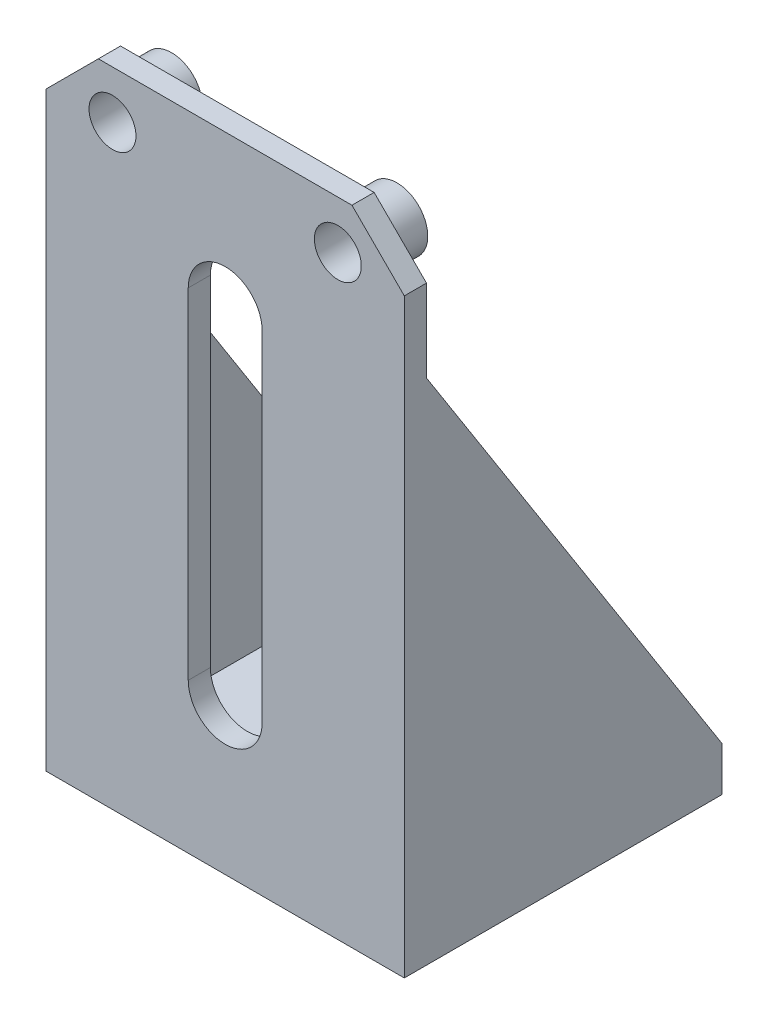
ISO-10303-21;
HEADER;
FILE_DESCRIPTION(('STEP AP214'),'2;1');
FILE_NAME('part.step','',(''),(''),'','','');
FILE_SCHEMA(('AUTOMOTIVE_DESIGN { 1 0 10303 214 1 1 1 1 }'));
ENDSEC;
DATA;
#1=APPLICATION_CONTEXT('core data for automotive mechanical design processes');
#2=APPLICATION_PROTOCOL_DEFINITION('international standard','automotive_design',2000,#1);
#3=PRODUCT_CONTEXT('',#1,'mechanical');
#4=PRODUCT('Part','Part','',(#3));
#5=PRODUCT_RELATED_PRODUCT_CATEGORY('part','',(#4));
#6=PRODUCT_DEFINITION_FORMATION('','',#4);
#7=PRODUCT_DEFINITION_CONTEXT('part definition',#1,'design');
#8=PRODUCT_DEFINITION('design','',#6,#7);
#9=PRODUCT_DEFINITION_SHAPE('','',#8);
#10=(LENGTH_UNIT() NAMED_UNIT(*) SI_UNIT(.MILLI.,.METRE.));
#11=(NAMED_UNIT(*) PLANE_ANGLE_UNIT() SI_UNIT($,.RADIAN.));
#12=(NAMED_UNIT(*) SI_UNIT($,.STERADIAN.) SOLID_ANGLE_UNIT());
#13=UNCERTAINTY_MEASURE_WITH_UNIT(LENGTH_MEASURE(1.E-05),#10,'distance_accuracy_value','');
#14=(GEOMETRIC_REPRESENTATION_CONTEXT(3) GLOBAL_UNCERTAINTY_ASSIGNED_CONTEXT((#13)) GLOBAL_UNIT_ASSIGNED_CONTEXT((#10,
#11,#12)) REPRESENTATION_CONTEXT('',''));
#15=CARTESIAN_POINT('',(0.,0.,0.));
#16=DIRECTION('',(0.,0.,1.));
#17=DIRECTION('',(1.,0.,0.));
#18=AXIS2_PLACEMENT_3D('',#15,#16,#17);
#19=CARTESIAN_POINT('',(0.,0.,0.));
#20=DIRECTION('',(0.,0.,-1.));
#21=DIRECTION('',(-1.,0.,0.));
#22=AXIS2_PLACEMENT_3D('',#19,#20,#21);
#23=PLANE('',#22);
#24=CARTESIAN_POINT('',(-12.1712863458922,57.275,0.));
#25=DIRECTION('',(0.,0.,1.));
#26=DIRECTION('',(1.,0.,0.));
#27=AXIS2_PLACEMENT_3D('',#24,#25,#26);
#28=CIRCLE('',#27,5.);
#29=CARTESIAN_POINT('',(-7.17128634589222,57.275,0.));
#30=VERTEX_POINT('',#29);
#31=CARTESIAN_POINT('',(-17.1712863458922,57.275,0.));
#32=VERTEX_POINT('',#31);
#33=EDGE_CURVE('E257',#30,#32,#28,.T.);
#34=ORIENTED_EDGE('',*,*,#33,.T.);
#35=DIRECTION('',(0.,-1.,0.));
#36=VECTOR('',#35,1.);
#37=CARTESIAN_POINT('',(-17.1712863458922,57.275,0.));
#38=LINE('',#37,#36);
#39=CARTESIAN_POINT('',(-17.1712863458922,11.275,0.));
#40=VERTEX_POINT('',#39);
#41=EDGE_CURVE('E260',#32,#40,#38,.T.);
#42=ORIENTED_EDGE('',*,*,#41,.T.);
#43=CARTESIAN_POINT('',(-12.1712863458922,11.275,0.));
#44=DIRECTION('',(0.,0.,1.));
#45=DIRECTION('',(1.,0.,0.));
#46=AXIS2_PLACEMENT_3D('',#43,#44,#45);
#47=CIRCLE('',#46,5.);
#48=CARTESIAN_POINT('',(-7.17128634589222,11.275,0.));
#49=VERTEX_POINT('',#48);
#50=EDGE_CURVE('E100',#40,#49,#47,.T.);
#51=ORIENTED_EDGE('',*,*,#50,.T.);
#52=DIRECTION('',(0.,1.,0.));
#53=VECTOR('',#52,1.);
#54=CARTESIAN_POINT('',(-7.17128634589222,57.275,0.));
#55=LINE('',#54,#53);
#56=EDGE_CURVE('E265',#49,#30,#55,.T.);
#57=ORIENTED_EDGE('',*,*,#56,.T.);
#58=EDGE_LOOP('',(#34,#42,#51,#57));
#59=FACE_BOUND('',#58,.T.);
#60=CARTESIAN_POINT('',(3.07871365410777,71.55,0.));
#61=DIRECTION('',(0.,0.,-1.));
#62=DIRECTION('',(-1.,0.,0.));
#63=AXIS2_PLACEMENT_3D('',#60,#61,#62);
#64=CIRCLE('',#63,4.175);
#65=CARTESIAN_POINT('',(-1.09628634589223,71.55,0.));
#66=VERTEX_POINT('',#65);
#67=EDGE_CURVE('E298',#66,#66,#64,.T.);
#68=ORIENTED_EDGE('',*,*,#67,.F.);
#69=EDGE_LOOP('',(#68));
#70=FACE_BOUND('',#69,.T.);
#71=CARTESIAN_POINT('',(-27.4212863458922,71.55,0.));
#72=DIRECTION('',(0.,0.,-1.));
#73=DIRECTION('',(-1.,0.,0.));
#74=AXIS2_PLACEMENT_3D('',#71,#72,#73);
#75=CIRCLE('',#74,4.175);
#76=CARTESIAN_POINT('',(-31.5962863458922,71.55,0.));
#77=VERTEX_POINT('',#76);
#78=EDGE_CURVE('E295',#77,#77,#75,.T.);
#79=ORIENTED_EDGE('',*,*,#78,.F.);
#80=EDGE_LOOP('',(#79));
#81=FACE_BOUND('',#80,.T.);
#82=DIRECTION('',(0.,-1.,0.));
#83=VECTOR('',#82,1.);
#84=CARTESIAN_POINT('',(-33.4212863458922,-6.00000000000001,0.));
#85=LINE('',#84,#83);
#86=CARTESIAN_POINT('',(-33.4212863458922,59.8372093023255,0.));
#87=VERTEX_POINT('',#86);
#88=CARTESIAN_POINT('',(-33.4212863458922,-6.00000000000001,0.));
#89=VERTEX_POINT('',#88);
#90=EDGE_CURVE('E312',#87,#89,#85,.T.);
#91=ORIENTED_EDGE('',*,*,#90,.F.);
#92=DIRECTION('',(1.,0.,0.));
#93=VECTOR('',#92,1.);
#94=CARTESIAN_POINT('',(0.,59.8372093023256,0.));
#95=LINE('',#94,#93);
#96=CARTESIAN_POINT('',(-36.4212863458922,59.8372093023255,0.));
#97=VERTEX_POINT('',#96);
#98=EDGE_CURVE('E245',#97,#87,#95,.T.);
#99=ORIENTED_EDGE('',*,*,#98,.F.);
#100=DIRECTION('',(0.,-1.,0.));
#101=VECTOR('',#100,1.);
#102=CARTESIAN_POINT('',(-36.4212863458922,-3.00000000000001,0.));
#103=LINE('',#102,#101);
#104=CARTESIAN_POINT('',(-36.4212863458922,70.964213562373,0.));
#105=VERTEX_POINT('',#104);
#106=EDGE_CURVE('E209',#105,#97,#103,.T.);
#107=ORIENTED_EDGE('',*,*,#106,.F.);
#108=DIRECTION('',(0.707106781186546,0.707106781186549,0.));
#109=VECTOR('',#108,1.);
#110=CARTESIAN_POINT('',(-36.4212863458922,70.964213562373,0.));
#111=LINE('',#110,#109);
#112=CARTESIAN_POINT('',(-29.3354999082653,78.05,0.));
#113=VERTEX_POINT('',#112);
#114=EDGE_CURVE('E233',#105,#113,#111,.T.);
#115=ORIENTED_EDGE('',*,*,#114,.T.);
#116=DIRECTION('',(1.,0.,0.));
#117=VECTOR('',#116,1.);
#118=CARTESIAN_POINT('',(0.,78.05,0.));
#119=LINE('',#118,#117);
#120=CARTESIAN_POINT('',(4.99292721648086,78.05,0.));
#121=VERTEX_POINT('',#120);
#122=EDGE_CURVE('E219',#113,#121,#119,.T.);
#123=ORIENTED_EDGE('',*,*,#122,.T.);
#124=DIRECTION('',(-0.707106781186546,0.707106781186549,0.));
#125=VECTOR('',#124,1.);
#126=CARTESIAN_POINT('',(41.5214636082404,41.5214636082403,0.));
#127=LINE('',#126,#125);
#128=CARTESIAN_POINT('',(12.0787136541078,70.964213562373,0.));
#129=VERTEX_POINT('',#128);
#130=EDGE_CURVE('E215',#129,#121,#127,.T.);
#131=ORIENTED_EDGE('',*,*,#130,.F.);
#132=DIRECTION('',(0.,1.,0.));
#133=VECTOR('',#132,1.);
#134=CARTESIAN_POINT('',(12.0787136541078,-2.99999999999996,0.));
#135=LINE('',#134,#133);
#136=CARTESIAN_POINT('',(12.0787136541078,59.8372093023255,0.));
#137=VERTEX_POINT('',#136);
#138=EDGE_CURVE('E199',#137,#129,#135,.T.);
#139=ORIENTED_EDGE('',*,*,#138,.F.);
#140=DIRECTION('',(1.,0.,0.));
#141=VECTOR('',#140,1.);
#142=CARTESIAN_POINT('',(0.,59.8372093023256,0.));
#143=LINE('',#142,#141);
#144=CARTESIAN_POINT('',(9.07871365410775,59.8372093023255,0.));
#145=VERTEX_POINT('',#144);
#146=EDGE_CURVE('E210',#145,#137,#143,.T.);
#147=ORIENTED_EDGE('',*,*,#146,.F.);
#148=DIRECTION('',(0.,-1.,0.));
#149=VECTOR('',#148,1.);
#150=CARTESIAN_POINT('',(9.07871365410777,48.0313996107964,0.));
#151=LINE('',#150,#149);
#152=CARTESIAN_POINT('',(9.07871365410777,-6.00000000000001,0.));
#153=VERTEX_POINT('',#152);
#154=EDGE_CURVE('E314',#145,#153,#151,.T.);
#155=ORIENTED_EDGE('',*,*,#154,.T.);
#156=DIRECTION('',(1.,0.,0.));
#157=VECTOR('',#156,1.);
#158=CARTESIAN_POINT('',(9.07871365410777,-6.00000000000001,0.));
#159=LINE('',#158,#157);
#160=EDGE_CURVE('E309',#89,#153,#159,.T.);
#161=ORIENTED_EDGE('',*,*,#160,.F.);
#162=EDGE_LOOP('',(#91,#99,#107,#115,#123,#131,#139,#147,#155,#161));
#163=FACE_BOUND('',#162,.T.);
#164=ADVANCED_FACE('F83',(#59,#70,#81,#163),#23,.T.);
#165=CARTESIAN_POINT('',(-33.4212863458922,-6.00000000000001,3.));
#166=DIRECTION('',(1.,0.,0.));
#167=DIRECTION('',(0.,0.,-1.));
#168=AXIS2_PLACEMENT_3D('',#165,#166,#167);
#169=PLANE('',#168);
#170=ORIENTED_EDGE('',*,*,#90,.T.);
#171=DIRECTION('',(0.,0.,-1.));
#172=VECTOR('',#171,1.);
#173=CARTESIAN_POINT('',(-33.4212863458922,-6.00000000000001,3.));
#174=LINE('',#173,#172);
#175=CARTESIAN_POINT('',(-33.4212863458922,-6.00000000000001,-40.));
#176=VERTEX_POINT('',#175);
#177=EDGE_CURVE('E87',#89,#176,#174,.T.);
#178=ORIENTED_EDGE('',*,*,#177,.T.);
#179=DIRECTION('',(0.,-1.,0.));
#180=VECTOR('',#179,1.);
#181=CARTESIAN_POINT('',(-33.4212863458922,-6.00000000000001,-40.));
#182=LINE('',#181,#180);
#183=CARTESIAN_POINT('',(-33.4212863458922,-3.00000000000001,-40.));
#184=VERTEX_POINT('',#183);
#185=EDGE_CURVE('E316',#184,#176,#182,.T.);
#186=ORIENTED_EDGE('',*,*,#185,.F.);
#187=DIRECTION('',(0.,-0.843584345436487,-0.536996696576891));
#188=VECTOR('',#187,1.);
#189=CARTESIAN_POINT('',(-33.4212863458922,64.55,3.));
#190=LINE('',#189,#188);
#191=EDGE_CURVE('E243',#87,#184,#190,.T.);
#192=ORIENTED_EDGE('',*,*,#191,.F.);
#193=EDGE_LOOP('',(#170,#178,#186,#192));
#194=FACE_BOUND('',#193,.T.);
#195=ADVANCED_FACE('F85',(#194),#169,.T.);
#196=CARTESIAN_POINT('',(-36.4212863458922,-3.00000000000001,3.));
#197=DIRECTION('',(-1.,0.,0.));
#198=DIRECTION('',(0.,0.,1.));
#199=AXIS2_PLACEMENT_3D('',#196,#197,#198);
#200=PLANE('',#199);
#201=ORIENTED_EDGE('',*,*,#106,.T.);
#202=DIRECTION('',(0.,-0.843584345436487,-0.536996696576891));
#203=VECTOR('',#202,1.);
#204=CARTESIAN_POINT('',(-36.4212863458922,64.55,3.));
#205=LINE('',#204,#203);
#206=CARTESIAN_POINT('',(-36.4212863458922,-3.00000000000001,-40.));
#207=VERTEX_POINT('',#206);
#208=EDGE_CURVE('E231',#97,#207,#205,.T.);
#209=ORIENTED_EDGE('',*,*,#208,.T.);
#210=DIRECTION('',(0.,1.,0.));
#211=VECTOR('',#210,1.);
#212=CARTESIAN_POINT('',(-36.4212863458922,-3.00000000000001,-40.));
#213=LINE('',#212,#211);
#214=CARTESIAN_POINT('',(-36.4212863458922,-9.00000000000002,-40.));
#215=VERTEX_POINT('',#214);
#216=EDGE_CURVE('E333',#215,#207,#213,.T.);
#217=ORIENTED_EDGE('',*,*,#216,.F.);
#218=DIRECTION('',(0.,0.,-1.));
#219=VECTOR('',#218,1.);
#220=CARTESIAN_POINT('',(-36.4212863458922,-9.00000000000002,3.));
#221=LINE('',#220,#219);
#222=CARTESIAN_POINT('',(-36.4212863458922,-9.00000000000002,3.));
#223=VERTEX_POINT('',#222);
#224=EDGE_CURVE('E12',#223,#215,#221,.T.);
#225=ORIENTED_EDGE('',*,*,#224,.F.);
#226=DIRECTION('',(0.,1.,0.));
#227=VECTOR('',#226,1.);
#228=CARTESIAN_POINT('',(-36.4212863458922,-3.00000000000001,3.));
#229=LINE('',#228,#227);
#230=CARTESIAN_POINT('',(-36.4212863458922,70.964213562373,3.));
#231=VERTEX_POINT('',#230);
#232=EDGE_CURVE('E343',#223,#231,#229,.T.);
#233=ORIENTED_EDGE('',*,*,#232,.T.);
#234=DIRECTION('',(0.,0.,1.));
#235=VECTOR('',#234,1.);
#236=CARTESIAN_POINT('',(-36.4212863458922,70.964213562373,0.));
#237=LINE('',#236,#235);
#238=EDGE_CURVE('E229',#105,#231,#237,.T.);
#239=ORIENTED_EDGE('',*,*,#238,.F.);
#240=EDGE_LOOP('',(#201,#209,#217,#225,#233,#239));
#241=FACE_BOUND('',#240,.T.);
#242=ADVANCED_FACE('F363',(#241),#200,.T.);
#243=CARTESIAN_POINT('',(-36.4212863458922,-9.00000000000002,3.));
#244=DIRECTION('',(0.,-1.,0.));
#245=DIRECTION('',(0.,0.,-1.));
#246=AXIS2_PLACEMENT_3D('',#243,#244,#245);
#247=PLANE('',#246);
#248=ORIENTED_EDGE('',*,*,#224,.T.);
#249=DIRECTION('',(-1.,0.,0.));
#250=VECTOR('',#249,1.);
#251=CARTESIAN_POINT('',(12.0787136541078,-9.00000000000002,-40.));
#252=LINE('',#251,#250);
#253=CARTESIAN_POINT('',(12.0787136541078,-9.00000000000002,-40.));
#254=VERTEX_POINT('',#253);
#255=EDGE_CURVE('E331',#254,#215,#252,.T.);
#256=ORIENTED_EDGE('',*,*,#255,.F.);
#257=DIRECTION('',(0.,0.,-1.));
#258=VECTOR('',#257,1.);
#259=CARTESIAN_POINT('',(12.0787136541078,-9.00000000000002,3.));
#260=LINE('',#259,#258);
#261=CARTESIAN_POINT('',(12.0787136541078,-9.00000000000002,3.));
#262=VERTEX_POINT('',#261);
#263=EDGE_CURVE('E92',#262,#254,#260,.T.);
#264=ORIENTED_EDGE('',*,*,#263,.F.);
#265=DIRECTION('',(-1.,0.,0.));
#266=VECTOR('',#265,1.);
#267=CARTESIAN_POINT('',(12.0787136541078,-9.00000000000002,3.));
#268=LINE('',#267,#266);
#269=EDGE_CURVE('E341',#262,#223,#268,.T.);
#270=ORIENTED_EDGE('',*,*,#269,.T.);
#271=EDGE_LOOP('',(#248,#256,#264,#270));
#272=FACE_BOUND('',#271,.T.);
#273=ADVANCED_FACE('F376',(#272),#247,.T.);
#274=CARTESIAN_POINT('',(12.0787136541078,-3.00000000000001,3.));
#275=DIRECTION('',(1.,0.,0.));
#276=DIRECTION('',(0.,1.,0.));
#277=AXIS2_PLACEMENT_3D('',#274,#275,#276);
#278=PLANE('',#277);
#279=DIRECTION('',(0.,0.843584345436487,0.536996696576891));
#280=VECTOR('',#279,1.);
#281=CARTESIAN_POINT('',(12.0787136541078,-3.00000000000001,-40.));
#282=LINE('',#281,#280);
#283=CARTESIAN_POINT('',(12.0787136541078,-3.00000000000001,-40.));
#284=VERTEX_POINT('',#283);
#285=EDGE_CURVE('E205',#284,#137,#282,.T.);
#286=ORIENTED_EDGE('',*,*,#285,.T.);
#287=ORIENTED_EDGE('',*,*,#138,.T.);
#288=DIRECTION('',(0.,0.,1.));
#289=VECTOR('',#288,1.);
#290=CARTESIAN_POINT('',(12.0787136541078,70.964213562373,0.));
#291=LINE('',#290,#289);
#292=CARTESIAN_POINT('',(12.0787136541078,70.964213562373,3.));
#293=VERTEX_POINT('',#292);
#294=EDGE_CURVE('E202',#129,#293,#291,.T.);
#295=ORIENTED_EDGE('',*,*,#294,.T.);
#296=DIRECTION('',(0.,-1.,0.));
#297=VECTOR('',#296,1.);
#298=CARTESIAN_POINT('',(12.0787136541078,-3.00000000000001,3.));
#299=LINE('',#298,#297);
#300=EDGE_CURVE('E339',#293,#262,#299,.T.);
#301=ORIENTED_EDGE('',*,*,#300,.T.);
#302=ORIENTED_EDGE('',*,*,#263,.T.);
#303=DIRECTION('',(0.,-1.,0.));
#304=VECTOR('',#303,1.);
#305=CARTESIAN_POINT('',(12.0787136541078,-3.00000000000001,-40.));
#306=LINE('',#305,#304);
#307=EDGE_CURVE('E328',#284,#254,#306,.T.);
#308=ORIENTED_EDGE('',*,*,#307,.F.);
#309=EDGE_LOOP('',(#286,#287,#295,#301,#302,#308));
#310=FACE_BOUND('',#309,.T.);
#311=ADVANCED_FACE('F201',(#310),#278,.T.);
#312=CARTESIAN_POINT('',(9.07871365410777,-6.00000000000001,3.));
#313=DIRECTION('',(-1.,0.,0.));
#314=DIRECTION('',(0.,0.,1.));
#315=AXIS2_PLACEMENT_3D('',#312,#313,#314);
#316=PLANE('',#315);
#317=DIRECTION('',(0.,0.,-1.));
#318=VECTOR('',#317,1.);
#319=CARTESIAN_POINT('',(9.07871365410777,-6.00000000000001,3.));
#320=LINE('',#319,#318);
#321=CARTESIAN_POINT('',(9.07871365410777,-6.00000000000001,-40.));
#322=VERTEX_POINT('',#321);
#323=EDGE_CURVE('E345',#153,#322,#320,.T.);
#324=ORIENTED_EDGE('',*,*,#323,.F.);
#325=ORIENTED_EDGE('',*,*,#154,.F.);
#326=DIRECTION('',(0.,0.843584345436487,0.536996696576891));
#327=VECTOR('',#326,1.);
#328=CARTESIAN_POINT('',(9.07871365410777,-3.00000000000001,-40.));
#329=LINE('',#328,#327);
#330=CARTESIAN_POINT('',(9.07871365410777,-3.00000000000001,-40.));
#331=VERTEX_POINT('',#330);
#332=EDGE_CURVE('E250',#331,#145,#329,.T.);
#333=ORIENTED_EDGE('',*,*,#332,.F.);
#334=DIRECTION('',(0.,1.,0.));
#335=VECTOR('',#334,1.);
#336=CARTESIAN_POINT('',(9.07871365410777,-6.00000000000001,-40.));
#337=LINE('',#336,#335);
#338=EDGE_CURVE('E322',#322,#331,#337,.T.);
#339=ORIENTED_EDGE('',*,*,#338,.F.);
#340=EDGE_LOOP('',(#324,#325,#333,#339));
#341=FACE_BOUND('',#340,.T.);
#342=ADVANCED_FACE('F369',(#341),#316,.T.);
#343=CARTESIAN_POINT('',(-33.4212863458922,-6.00000000000001,3.));
#344=DIRECTION('',(0.,1.,0.));
#345=DIRECTION('',(-1.,0.,0.));
#346=AXIS2_PLACEMENT_3D('',#343,#344,#345);
#347=PLANE('',#346);
#348=ORIENTED_EDGE('',*,*,#160,.T.);
#349=ORIENTED_EDGE('',*,*,#323,.T.);
#350=DIRECTION('',(1.,0.,0.));
#351=VECTOR('',#350,1.);
#352=CARTESIAN_POINT('',(-33.4212863458922,-6.00000000000001,-40.));
#353=LINE('',#352,#351);
#354=EDGE_CURVE('E319',#176,#322,#353,.T.);
#355=ORIENTED_EDGE('',*,*,#354,.F.);
#356=ORIENTED_EDGE('',*,*,#177,.F.);
#357=EDGE_LOOP('',(#348,#349,#355,#356));
#358=FACE_BOUND('',#357,.T.);
#359=ADVANCED_FACE('F354',(#358),#347,.T.);
#360=CARTESIAN_POINT('',(0.,0.,3.));
#361=DIRECTION('',(0.,0.,1.));
#362=DIRECTION('',(1.,0.,0.));
#363=AXIS2_PLACEMENT_3D('',#360,#361,#362);
#364=PLANE('',#363);
#365=DIRECTION('',(0.707106781186546,0.707106781186549,0.));
#366=VECTOR('',#365,1.);
#367=CARTESIAN_POINT('',(-36.4212863458922,70.964213562373,3.));
#368=LINE('',#367,#366);
#369=CARTESIAN_POINT('',(-29.3354999082653,78.05,3.));
#370=VERTEX_POINT('',#369);
#371=EDGE_CURVE('E236',#231,#370,#368,.T.);
#372=ORIENTED_EDGE('',*,*,#371,.F.);
#373=ORIENTED_EDGE('',*,*,#232,.F.);
#374=ORIENTED_EDGE('',*,*,#269,.F.);
#375=ORIENTED_EDGE('',*,*,#300,.F.);
#376=DIRECTION('',(-0.707106781186546,0.707106781186549,0.));
#377=VECTOR('',#376,1.);
#378=CARTESIAN_POINT('',(41.5214636082404,41.5214636082403,3.));
#379=LINE('',#378,#377);
#380=CARTESIAN_POINT('',(4.99292721648086,78.05,3.));
#381=VERTEX_POINT('',#380);
#382=EDGE_CURVE('E217',#293,#381,#379,.T.);
#383=ORIENTED_EDGE('',*,*,#382,.T.);
#384=DIRECTION('',(1.,0.,0.));
#385=VECTOR('',#384,1.);
#386=CARTESIAN_POINT('',(0.,78.05,3.));
#387=LINE('',#386,#385);
#388=EDGE_CURVE('E223',#370,#381,#387,.T.);
#389=ORIENTED_EDGE('',*,*,#388,.F.);
#390=EDGE_LOOP('',(#372,#373,#374,#375,#383,#389));
#391=FACE_BOUND('',#390,.T.);
#392=CARTESIAN_POINT('',(-12.1712863458922,57.275,3.));
#393=DIRECTION('',(0.,0.,1.));
#394=DIRECTION('',(1.,0.,0.));
#395=AXIS2_PLACEMENT_3D('',#392,#393,#394);
#396=CIRCLE('',#395,5.);
#397=CARTESIAN_POINT('',(-7.17128634589222,57.275,3.));
#398=VERTEX_POINT('',#397);
#399=CARTESIAN_POINT('',(-17.1712863458922,57.275,3.));
#400=VERTEX_POINT('',#399);
#401=EDGE_CURVE('E108',#398,#400,#396,.T.);
#402=ORIENTED_EDGE('',*,*,#401,.F.);
#403=DIRECTION('',(0.,1.,0.));
#404=VECTOR('',#403,1.);
#405=CARTESIAN_POINT('',(-7.17128634589222,57.275,3.));
#406=LINE('',#405,#404);
#407=CARTESIAN_POINT('',(-7.17128634589222,11.275,3.));
#408=VERTEX_POINT('',#407);
#409=EDGE_CURVE('E261',#408,#398,#406,.T.);
#410=ORIENTED_EDGE('',*,*,#409,.F.);
#411=CARTESIAN_POINT('',(-12.1712863458922,11.275,3.));
#412=DIRECTION('',(0.,0.,1.));
#413=DIRECTION('',(1.,0.,0.));
#414=AXIS2_PLACEMENT_3D('',#411,#412,#413);
#415=CIRCLE('',#414,5.);
#416=CARTESIAN_POINT('',(-17.1712863458922,11.275,3.));
#417=VERTEX_POINT('',#416);
#418=EDGE_CURVE('E273',#417,#408,#415,.T.);
#419=ORIENTED_EDGE('',*,*,#418,.F.);
#420=DIRECTION('',(0.,-1.,0.));
#421=VECTOR('',#420,1.);
#422=CARTESIAN_POINT('',(-17.1712863458922,57.275,3.));
#423=LINE('',#422,#421);
#424=EDGE_CURVE('E270',#400,#417,#423,.T.);
#425=ORIENTED_EDGE('',*,*,#424,.F.);
#426=EDGE_LOOP('',(#402,#410,#419,#425));
#427=FACE_BOUND('',#426,.T.);
#428=CARTESIAN_POINT('',(-27.4212863458922,71.55,3.));
#429=DIRECTION('',(0.,0.,1.));
#430=DIRECTION('',(1.,0.,0.));
#431=AXIS2_PLACEMENT_3D('',#428,#429,#430);
#432=CIRCLE('',#431,3.175);
#433=CARTESIAN_POINT('',(-24.2462863458922,71.55,3.));
#434=VERTEX_POINT('',#433);
#435=EDGE_CURVE('E306',#434,#434,#432,.T.);
#436=ORIENTED_EDGE('',*,*,#435,.F.);
#437=EDGE_LOOP('',(#436));
#438=FACE_BOUND('',#437,.T.);
#439=CARTESIAN_POINT('',(3.07871365410777,71.55,3.));
#440=DIRECTION('',(0.,0.,1.));
#441=DIRECTION('',(-1.,0.,0.));
#442=AXIS2_PLACEMENT_3D('',#439,#440,#441);
#443=CIRCLE('',#442,3.175);
#444=CARTESIAN_POINT('',(-0.0962863458922273,71.55,3.));
#445=VERTEX_POINT('',#444);
#446=EDGE_CURVE('E303',#445,#445,#443,.T.);
#447=ORIENTED_EDGE('',*,*,#446,.F.);
#448=EDGE_LOOP('',(#447));
#449=FACE_BOUND('',#448,.T.);
#450=ADVANCED_FACE('F380',(#391,#427,#438,#449),#364,.T.);
#451=CARTESIAN_POINT('',(0.,0.,-40.));
#452=DIRECTION('',(0.,0.,1.));
#453=DIRECTION('',(1.,0.,0.));
#454=AXIS2_PLACEMENT_3D('',#451,#452,#453);
#455=PLANE('',#454);
#456=ORIENTED_EDGE('',*,*,#185,.T.);
#457=ORIENTED_EDGE('',*,*,#354,.T.);
#458=ORIENTED_EDGE('',*,*,#338,.T.);
#459=DIRECTION('',(1.,0.,0.));
#460=VECTOR('',#459,1.);
#461=CARTESIAN_POINT('',(9.07871365410777,-3.00000000000001,-40.));
#462=LINE('',#461,#460);
#463=EDGE_CURVE('E325',#331,#284,#462,.T.);
#464=ORIENTED_EDGE('',*,*,#463,.T.);
#465=ORIENTED_EDGE('',*,*,#307,.T.);
#466=ORIENTED_EDGE('',*,*,#255,.T.);
#467=ORIENTED_EDGE('',*,*,#216,.T.);
#468=DIRECTION('',(1.,0.,0.));
#469=VECTOR('',#468,1.);
#470=CARTESIAN_POINT('',(-33.4212863458922,-3.00000000000001,-40.));
#471=LINE('',#470,#469);
#472=EDGE_CURVE('E336',#207,#184,#471,.T.);
#473=ORIENTED_EDGE('',*,*,#472,.T.);
#474=EDGE_LOOP('',(#456,#457,#458,#464,#465,#466,#467,#473));
#475=FACE_BOUND('',#474,.T.);
#476=ADVANCED_FACE('F357',(#475),#455,.F.);
#477=CARTESIAN_POINT('',(-27.4212863458922,71.55,3.));
#478=DIRECTION('',(0.,0.,-1.));
#479=DIRECTION('',(-1.,0.,0.));
#480=AXIS2_PLACEMENT_3D('',#477,#478,#479);
#481=CYLINDRICAL_SURFACE('',#480,3.175);
#482=ORIENTED_EDGE('',*,*,#435,.T.);
#483=EDGE_LOOP('',(#482));
#484=FACE_BOUND('',#483,.T.);
#485=CARTESIAN_POINT('',(-27.4212863458922,71.55,-3.));
#486=DIRECTION('',(0.,0.,-1.));
#487=DIRECTION('',(-1.,0.,0.));
#488=AXIS2_PLACEMENT_3D('',#485,#486,#487);
#489=CIRCLE('',#488,3.175);
#490=CARTESIAN_POINT('',(-30.5962863458922,71.55,-3.));
#491=VERTEX_POINT('',#490);
#492=EDGE_CURVE('E288',#491,#491,#489,.T.);
#493=ORIENTED_EDGE('',*,*,#492,.T.);
#494=EDGE_LOOP('',(#493));
#495=FACE_BOUND('',#494,.T.);
#496=ADVANCED_FACE('F403',(#484,#495),#481,.F.);
#497=CARTESIAN_POINT('',(3.07871365410777,71.55,3.));
#498=DIRECTION('',(0.,0.,-1.));
#499=DIRECTION('',(-1.,0.,0.));
#500=AXIS2_PLACEMENT_3D('',#497,#498,#499);
#501=CYLINDRICAL_SURFACE('',#500,3.175);
#502=ORIENTED_EDGE('',*,*,#446,.T.);
#503=EDGE_LOOP('',(#502));
#504=FACE_BOUND('',#503,.T.);
#505=CARTESIAN_POINT('',(3.07871365410777,71.55,-3.));
#506=DIRECTION('',(0.,0.,-1.));
#507=DIRECTION('',(-1.,0.,0.));
#508=AXIS2_PLACEMENT_3D('',#505,#506,#507);
#509=CIRCLE('',#508,3.175);
#510=CARTESIAN_POINT('',(-0.0962863458922273,71.55,-3.));
#511=VERTEX_POINT('',#510);
#512=EDGE_CURVE('E292',#511,#511,#509,.T.);
#513=ORIENTED_EDGE('',*,*,#512,.T.);
#514=EDGE_LOOP('',(#513));
#515=FACE_BOUND('',#514,.T.);
#516=ADVANCED_FACE('F439',(#504,#515),#501,.F.);
#517=CARTESIAN_POINT('',(3.07871365410777,71.55,-3.));
#518=DIRECTION('',(0.,0.,1.));
#519=DIRECTION('',(1.,0.,0.));
#520=AXIS2_PLACEMENT_3D('',#517,#518,#519);
#521=CYLINDRICAL_SURFACE('',#520,4.175);
#522=ORIENTED_EDGE('',*,*,#67,.T.);
#523=EDGE_LOOP('',(#522));
#524=FACE_BOUND('',#523,.T.);
#525=CARTESIAN_POINT('',(3.07871365410777,71.55,-5.));
#526=DIRECTION('',(0.,0.,-1.));
#527=DIRECTION('',(-1.,0.,0.));
#528=AXIS2_PLACEMENT_3D('',#525,#526,#527);
#529=CIRCLE('',#528,4.175);
#530=CARTESIAN_POINT('',(-1.09628634589223,71.55,-5.));
#531=VERTEX_POINT('',#530);
#532=EDGE_CURVE('E289',#531,#531,#529,.T.);
#533=ORIENTED_EDGE('',*,*,#532,.F.);
#534=EDGE_LOOP('',(#533));
#535=FACE_BOUND('',#534,.T.);
#536=ADVANCED_FACE('F446',(#524,#535),#521,.T.);
#537=CARTESIAN_POINT('',(-27.4212863458922,71.55,-3.));
#538=DIRECTION('',(0.,0.,1.));
#539=DIRECTION('',(1.,0.,0.));
#540=AXIS2_PLACEMENT_3D('',#537,#538,#539);
#541=CYLINDRICAL_SURFACE('',#540,4.175);
#542=ORIENTED_EDGE('',*,*,#78,.T.);
#543=EDGE_LOOP('',(#542));
#544=FACE_BOUND('',#543,.T.);
#545=CARTESIAN_POINT('',(-27.4212863458922,71.55,-5.));
#546=DIRECTION('',(0.,0.,-1.));
#547=DIRECTION('',(-1.,0.,0.));
#548=AXIS2_PLACEMENT_3D('',#545,#546,#547);
#549=CIRCLE('',#548,4.175);
#550=CARTESIAN_POINT('',(-31.5962863458922,71.55,-5.));
#551=VERTEX_POINT('',#550);
#552=EDGE_CURVE('E280',#551,#551,#549,.T.);
#553=ORIENTED_EDGE('',*,*,#552,.F.);
#554=EDGE_LOOP('',(#553));
#555=FACE_BOUND('',#554,.T.);
#556=ADVANCED_FACE('F453',(#544,#555),#541,.T.);
#557=CARTESIAN_POINT('',(3.07871365410777,71.55,-3.));
#558=DIRECTION('',(0.,0.,-1.));
#559=DIRECTION('',(-1.,0.,0.));
#560=AXIS2_PLACEMENT_3D('',#557,#558,#559);
#561=PLANE('',#560);
#562=ORIENTED_EDGE('',*,*,#512,.F.);
#563=EDGE_LOOP('',(#562));
#564=FACE_BOUND('',#563,.T.);
#565=ADVANCED_FACE('F461',(#564),#561,.F.);
#566=CARTESIAN_POINT('',(3.07871365410777,71.55,-5.));
#567=DIRECTION('',(0.,0.,-1.));
#568=DIRECTION('',(-1.,0.,0.));
#569=AXIS2_PLACEMENT_3D('',#566,#567,#568);
#570=PLANE('',#569);
#571=ORIENTED_EDGE('',*,*,#532,.T.);
#572=EDGE_LOOP('',(#571));
#573=FACE_BOUND('',#572,.T.);
#574=ADVANCED_FACE('F469',(#573),#570,.T.);
#575=CARTESIAN_POINT('',(-27.4212863458922,71.55,-3.));
#576=DIRECTION('',(0.,0.,-1.));
#577=DIRECTION('',(-1.,0.,0.));
#578=AXIS2_PLACEMENT_3D('',#575,#576,#577);
#579=PLANE('',#578);
#580=ORIENTED_EDGE('',*,*,#492,.F.);
#581=EDGE_LOOP('',(#580));
#582=FACE_BOUND('',#581,.T.);
#583=ADVANCED_FACE('F477',(#582),#579,.F.);
#584=CARTESIAN_POINT('',(-27.4212863458922,71.55,-5.));
#585=DIRECTION('',(0.,0.,-1.));
#586=DIRECTION('',(-1.,0.,0.));
#587=AXIS2_PLACEMENT_3D('',#584,#585,#586);
#588=PLANE('',#587);
#589=ORIENTED_EDGE('',*,*,#552,.T.);
#590=EDGE_LOOP('',(#589));
#591=FACE_BOUND('',#590,.T.);
#592=ADVANCED_FACE('F485',(#591),#588,.T.);
#593=CARTESIAN_POINT('',(-12.1712863458922,57.275,0.));
#594=DIRECTION('',(0.,0.,1.));
#595=DIRECTION('',(1.,0.,0.));
#596=AXIS2_PLACEMENT_3D('',#593,#594,#595);
#597=CYLINDRICAL_SURFACE('',#596,5.);
#598=ORIENTED_EDGE('',*,*,#401,.T.);
#599=DIRECTION('',(0.,0.,1.));
#600=VECTOR('',#599,1.);
#601=CARTESIAN_POINT('',(-17.1712863458922,57.275,0.));
#602=LINE('',#601,#600);
#603=EDGE_CURVE('E268',#32,#400,#602,.T.);
#604=ORIENTED_EDGE('',*,*,#603,.F.);
#605=ORIENTED_EDGE('',*,*,#33,.F.);
#606=DIRECTION('',(0.,0.,1.));
#607=VECTOR('',#606,1.);
#608=CARTESIAN_POINT('',(-7.17128634589222,57.275,0.));
#609=LINE('',#608,#607);
#610=EDGE_CURVE('E278',#30,#398,#609,.T.);
#611=ORIENTED_EDGE('',*,*,#610,.T.);
#612=EDGE_LOOP('',(#598,#604,#605,#611));
#613=FACE_BOUND('',#612,.T.);
#614=ADVANCED_FACE('F493',(#613),#597,.F.);
#615=CARTESIAN_POINT('',(-7.17128634589222,57.275,0.));
#616=DIRECTION('',(1.,0.,0.));
#617=DIRECTION('',(0.,0.,-1.));
#618=AXIS2_PLACEMENT_3D('',#615,#616,#617);
#619=PLANE('',#618);
#620=ORIENTED_EDGE('',*,*,#409,.T.);
#621=ORIENTED_EDGE('',*,*,#610,.F.);
#622=ORIENTED_EDGE('',*,*,#56,.F.);
#623=DIRECTION('',(0.,0.,1.));
#624=VECTOR('',#623,1.);
#625=CARTESIAN_POINT('',(-7.17128634589222,11.275,0.));
#626=LINE('',#625,#624);
#627=EDGE_CURVE('E281',#49,#408,#626,.T.);
#628=ORIENTED_EDGE('',*,*,#627,.T.);
#629=EDGE_LOOP('',(#620,#621,#622,#628));
#630=FACE_BOUND('',#629,.T.);
#631=ADVANCED_FACE('F501',(#630),#619,.F.);
#632=CARTESIAN_POINT('',(-12.1712863458922,11.275,0.));
#633=DIRECTION('',(0.,0.,1.));
#634=DIRECTION('',(1.,0.,0.));
#635=AXIS2_PLACEMENT_3D('',#632,#633,#634);
#636=CYLINDRICAL_SURFACE('',#635,5.);
#637=ORIENTED_EDGE('',*,*,#418,.T.);
#638=ORIENTED_EDGE('',*,*,#627,.F.);
#639=ORIENTED_EDGE('',*,*,#50,.F.);
#640=DIRECTION('',(0.,0.,1.));
#641=VECTOR('',#640,1.);
#642=CARTESIAN_POINT('',(-17.1712863458922,11.275,0.));
#643=LINE('',#642,#641);
#644=EDGE_CURVE('E283',#40,#417,#643,.T.);
#645=ORIENTED_EDGE('',*,*,#644,.T.);
#646=EDGE_LOOP('',(#637,#638,#639,#645));
#647=FACE_BOUND('',#646,.T.);
#648=ADVANCED_FACE('F508',(#647),#636,.F.);
#649=CARTESIAN_POINT('',(-17.1712863458922,57.275,0.));
#650=DIRECTION('',(-1.,0.,0.));
#651=DIRECTION('',(0.,0.,1.));
#652=AXIS2_PLACEMENT_3D('',#649,#650,#651);
#653=PLANE('',#652);
#654=ORIENTED_EDGE('',*,*,#424,.T.);
#655=ORIENTED_EDGE('',*,*,#644,.F.);
#656=ORIENTED_EDGE('',*,*,#41,.F.);
#657=ORIENTED_EDGE('',*,*,#603,.T.);
#658=EDGE_LOOP('',(#654,#655,#656,#657));
#659=FACE_BOUND('',#658,.T.);
#660=ADVANCED_FACE('F516',(#659),#653,.F.);
#661=CARTESIAN_POINT('',(9.07871365410777,-3.00000000000001,-40.));
#662=DIRECTION('',(0.,0.536996696576891,-0.843584345436487));
#663=DIRECTION('',(0.,0.843584345436488,0.536996696576891));
#664=AXIS2_PLACEMENT_3D('',#661,#662,#663);
#665=PLANE('',#664);
#666=ORIENTED_EDGE('',*,*,#332,.T.);
#667=ORIENTED_EDGE('',*,*,#146,.T.);
#668=ORIENTED_EDGE('',*,*,#285,.F.);
#669=ORIENTED_EDGE('',*,*,#463,.F.);
#670=EDGE_LOOP('',(#666,#667,#668,#669));
#671=FACE_BOUND('',#670,.T.);
#672=ADVANCED_FACE('F523',(#671),#665,.T.);
#673=CARTESIAN_POINT('',(-33.4212863458922,64.55,3.));
#674=DIRECTION('',(0.,0.536996696576891,-0.843584345436487));
#675=DIRECTION('',(0.,0.843584345436488,0.536996696576891));
#676=AXIS2_PLACEMENT_3D('',#673,#674,#675);
#677=PLANE('',#676);
#678=ORIENTED_EDGE('',*,*,#208,.F.);
#679=ORIENTED_EDGE('',*,*,#98,.T.);
#680=ORIENTED_EDGE('',*,*,#191,.T.);
#681=ORIENTED_EDGE('',*,*,#472,.F.);
#682=EDGE_LOOP('',(#678,#679,#680,#681));
#683=FACE_BOUND('',#682,.T.);
#684=ADVANCED_FACE('F360',(#683),#677,.T.);
#685=CARTESIAN_POINT('',(41.5214636082404,41.5214636082403,0.));
#686=DIRECTION('',(0.707106781186549,0.707106781186546,0.));
#687=DIRECTION('',(-0.707106781186546,0.707106781186549,0.));
#688=AXIS2_PLACEMENT_3D('',#685,#686,#687);
#689=PLANE('',#688);
#690=ORIENTED_EDGE('',*,*,#382,.F.);
#691=ORIENTED_EDGE('',*,*,#294,.F.);
#692=ORIENTED_EDGE('',*,*,#130,.T.);
#693=DIRECTION('',(0.,0.,1.));
#694=VECTOR('',#693,1.);
#695=CARTESIAN_POINT('',(4.99292721648086,78.05,0.));
#696=LINE('',#695,#694);
#697=EDGE_CURVE('E218',#121,#381,#696,.T.);
#698=ORIENTED_EDGE('',*,*,#697,.T.);
#699=EDGE_LOOP('',(#690,#691,#692,#698));
#700=FACE_BOUND('',#699,.T.);
#701=ADVANCED_FACE('F214',(#700),#689,.T.);
#702=CARTESIAN_POINT('',(0.,78.05,0.));
#703=DIRECTION('',(0.,-1.,0.));
#704=DIRECTION('',(0.,0.,-1.));
#705=AXIS2_PLACEMENT_3D('',#702,#703,#704);
#706=PLANE('',#705);
#707=ORIENTED_EDGE('',*,*,#388,.T.);
#708=ORIENTED_EDGE('',*,*,#697,.F.);
#709=ORIENTED_EDGE('',*,*,#122,.F.);
#710=DIRECTION('',(0.,0.,1.));
#711=VECTOR('',#710,1.);
#712=CARTESIAN_POINT('',(-29.3354999082653,78.05,0.));
#713=LINE('',#712,#711);
#714=EDGE_CURVE('E235',#113,#370,#713,.T.);
#715=ORIENTED_EDGE('',*,*,#714,.T.);
#716=EDGE_LOOP('',(#707,#708,#709,#715));
#717=FACE_BOUND('',#716,.T.);
#718=ADVANCED_FACE('F385',(#717),#706,.F.);
#719=CARTESIAN_POINT('',(-36.4212863458922,70.964213562373,0.));
#720=DIRECTION('',(0.707106781186549,-0.707106781186546,0.));
#721=DIRECTION('',(0.707106781186546,0.707106781186549,0.));
#722=AXIS2_PLACEMENT_3D('',#719,#720,#721);
#723=PLANE('',#722);
#724=ORIENTED_EDGE('',*,*,#371,.T.);
#725=ORIENTED_EDGE('',*,*,#714,.F.);
#726=ORIENTED_EDGE('',*,*,#114,.F.);
#727=ORIENTED_EDGE('',*,*,#238,.T.);
#728=EDGE_LOOP('',(#724,#725,#726,#727));
#729=FACE_BOUND('',#728,.T.);
#730=ADVANCED_FACE('F383',(#729),#723,.F.);
#731=CLOSED_SHELL('',(#164,#195,#242,#273,#311,#342,#359,#450,#476,#496,#516,#536,#556,#565,
#574,#583,#592,#614,#631,#648,#660,#672,#684,#701,#718,#730));
#732=MANIFOLD_SOLID_BREP('B2',#731);
#733=ADVANCED_BREP_SHAPE_REPRESENTATION('',(#18,#732),#14);
#734=SHAPE_DEFINITION_REPRESENTATION(#9,#733);
ENDSEC;
END-ISO-10303-21;
